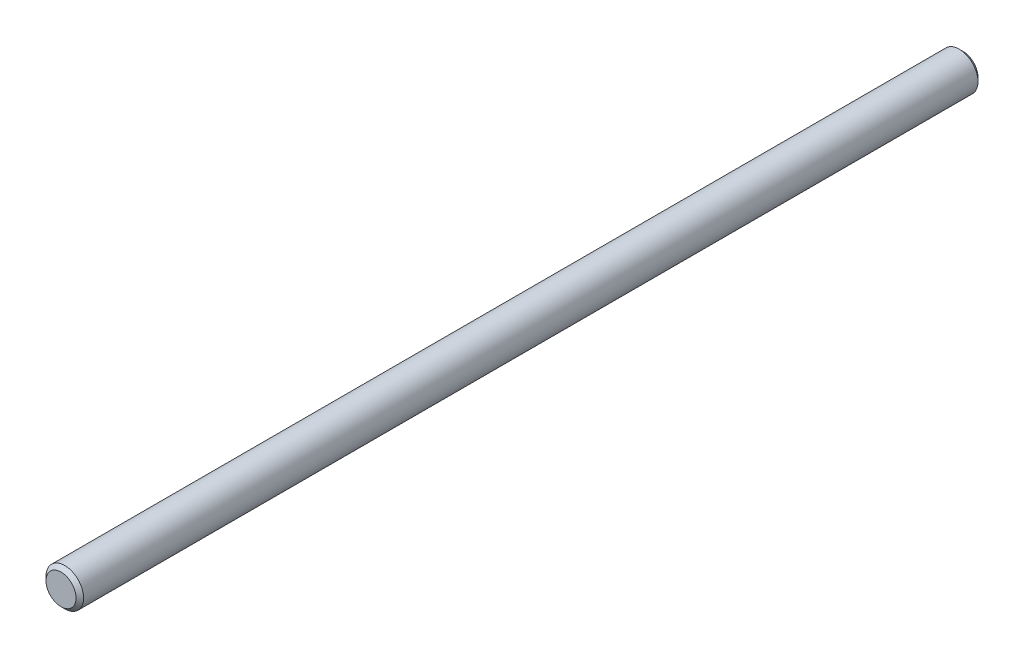
ISO-10303-21;
HEADER;
FILE_DESCRIPTION(('STEP AP214'),'2;1');
FILE_NAME('part.step','',(''),(''),'','','');
FILE_SCHEMA(('AUTOMOTIVE_DESIGN { 1 0 10303 214 1 1 1 1 }'));
ENDSEC;
DATA;
#1=APPLICATION_CONTEXT('core data for automotive mechanical design processes');
#2=APPLICATION_PROTOCOL_DEFINITION('international standard','automotive_design',2000,#1);
#3=PRODUCT_CONTEXT('',#1,'mechanical');
#4=PRODUCT('Part','Part','',(#3));
#5=PRODUCT_RELATED_PRODUCT_CATEGORY('part','',(#4));
#6=PRODUCT_DEFINITION_FORMATION('','',#4);
#7=PRODUCT_DEFINITION_CONTEXT('part definition',#1,'design');
#8=PRODUCT_DEFINITION('design','',#6,#7);
#9=PRODUCT_DEFINITION_SHAPE('','',#8);
#10=(LENGTH_UNIT() NAMED_UNIT(*) SI_UNIT(.MILLI.,.METRE.));
#11=(NAMED_UNIT(*) PLANE_ANGLE_UNIT() SI_UNIT($,.RADIAN.));
#12=(NAMED_UNIT(*) SI_UNIT($,.STERADIAN.) SOLID_ANGLE_UNIT());
#13=UNCERTAINTY_MEASURE_WITH_UNIT(LENGTH_MEASURE(1.E-05),#10,'distance_accuracy_value','');
#14=(GEOMETRIC_REPRESENTATION_CONTEXT(3) GLOBAL_UNCERTAINTY_ASSIGNED_CONTEXT((#13)) GLOBAL_UNIT_ASSIGNED_CONTEXT((#10,
#11,#12)) REPRESENTATION_CONTEXT('',''));
#15=CARTESIAN_POINT('',(0.,0.,0.));
#16=DIRECTION('',(0.,0.,1.));
#17=DIRECTION('',(1.,0.,0.));
#18=AXIS2_PLACEMENT_3D('',#15,#16,#17);
#19=CARTESIAN_POINT('',(0.,0.,152.4));
#20=DIRECTION('',(0.,0.,-1.));
#21=DIRECTION('',(-1.,0.,0.));
#22=AXIS2_PLACEMENT_3D('',#19,#20,#21);
#23=CYLINDRICAL_SURFACE('',#22,6.35);
#24=CARTESIAN_POINT('',(0.,0.,-151.13));
#25=DIRECTION('',(0.,0.,1.));
#26=DIRECTION('',(1.,0.,0.));
#27=AXIS2_PLACEMENT_3D('',#24,#25,#26);
#28=CIRCLE('',#27,6.35);
#29=CARTESIAN_POINT('',(-6.35,0.,-151.13));
#30=VERTEX_POINT('',#29);
#31=EDGE_CURVE('E41',#30,#30,#28,.T.);
#32=CARTESIAN_POINT('',(0.,0.,151.13));
#33=DIRECTION('',(0.,0.,1.));
#34=DIRECTION('',(1.,0.,0.));
#35=AXIS2_PLACEMENT_3D('',#32,#33,#34);
#36=CIRCLE('',#35,6.35);
#37=CARTESIAN_POINT('',(-6.35,0.,151.13));
#38=VERTEX_POINT('',#37);
#39=EDGE_CURVE('E45',#38,#38,#36,.F.);
#40=CARTESIAN_POINT('',(-6.35,0.,-151.13));
#41=CARTESIAN_POINT('',(-6.35,0.,-147.981458333333));
#42=CARTESIAN_POINT('',(-6.35,0.,-144.832916666666));
#43=CARTESIAN_POINT('',(-6.35,0.,-138.535833333333));
#44=CARTESIAN_POINT('',(-6.35,0.,-135.387291666666));
#45=CARTESIAN_POINT('',(-6.35,0.,-129.090208333333));
#46=CARTESIAN_POINT('',(-6.35,0.,-125.941666666666));
#47=CARTESIAN_POINT('',(-6.35,0.,-119.644583333333));
#48=CARTESIAN_POINT('',(-6.35,0.,-116.496041666666));
#49=CARTESIAN_POINT('',(-6.35,0.,-110.198958333333));
#50=CARTESIAN_POINT('',(-6.35,0.,-107.050416666666));
#51=CARTESIAN_POINT('',(-6.35,0.,-100.753333333333));
#52=CARTESIAN_POINT('',(-6.35,0.,-97.6047916666665));
#53=CARTESIAN_POINT('',(-6.35,0.,-91.3077083333331));
#54=CARTESIAN_POINT('',(-6.35,0.,-88.1591666666665));
#55=CARTESIAN_POINT('',(-6.35,0.,-81.8620833333332));
#56=CARTESIAN_POINT('',(-6.35,0.,-78.7135416666665));
#57=CARTESIAN_POINT('',(-6.35,0.,-72.4164583333332));
#58=CARTESIAN_POINT('',(-6.35,0.,-69.2679166666665));
#59=CARTESIAN_POINT('',(-6.35,0.,-62.9708333333331));
#60=CARTESIAN_POINT('',(-6.35,0.,-59.8222916666665));
#61=CARTESIAN_POINT('',(-6.35,0.,-53.5252083333331));
#62=CARTESIAN_POINT('',(-6.35,0.,-50.3766666666665));
#63=CARTESIAN_POINT('',(-6.35,0.,-44.0795833333331));
#64=CARTESIAN_POINT('',(-6.35,0.,-40.9310416666665));
#65=CARTESIAN_POINT('',(-6.35,0.,-34.6339583333331));
#66=CARTESIAN_POINT('',(-6.35,0.,-31.4854166666665));
#67=CARTESIAN_POINT('',(-6.35,0.,-25.1883333333331));
#68=CARTESIAN_POINT('',(-6.35,0.,-22.0397916666665));
#69=CARTESIAN_POINT('',(-6.35,0.,-15.7427083333331));
#70=CARTESIAN_POINT('',(-6.35,0.,-12.5941666666665));
#71=CARTESIAN_POINT('',(-6.35,0.,-6.29708333333315));
#72=CARTESIAN_POINT('',(-6.35,0.,-3.14854166666648));
#73=CARTESIAN_POINT('',(-6.35,0.,3.14854166666687));
#74=CARTESIAN_POINT('',(-6.35,0.,6.29708333333354));
#75=CARTESIAN_POINT('',(-6.35,0.,12.5941666666669));
#76=CARTESIAN_POINT('',(-6.35,0.,15.7427083333335));
#77=CARTESIAN_POINT('',(-6.35,0.,22.0397916666669));
#78=CARTESIAN_POINT('',(-6.35,0.,25.1883333333335));
#79=CARTESIAN_POINT('',(-6.35,0.,31.4854166666669));
#80=CARTESIAN_POINT('',(-6.35,0.,34.6339583333335));
#81=CARTESIAN_POINT('',(-6.35,0.,40.9310416666669));
#82=CARTESIAN_POINT('',(-6.35,0.,44.0795833333335));
#83=CARTESIAN_POINT('',(-6.35,0.,50.3766666666669));
#84=CARTESIAN_POINT('',(-6.35,0.,53.5252083333335));
#85=CARTESIAN_POINT('',(-6.35,0.,59.8222916666668));
#86=CARTESIAN_POINT('',(-6.35,0.,62.9708333333335));
#87=CARTESIAN_POINT('',(-6.35,0.,69.2679166666669));
#88=CARTESIAN_POINT('',(-6.35,0.,72.4164583333335));
#89=CARTESIAN_POINT('',(-6.35,0.,78.7135416666669));
#90=CARTESIAN_POINT('',(-6.35,0.,81.8620833333335));
#91=CARTESIAN_POINT('',(-6.35,0.,88.1591666666669));
#92=CARTESIAN_POINT('',(-6.35,0.,91.3077083333335));
#93=CARTESIAN_POINT('',(-6.35,0.,97.6047916666668));
#94=CARTESIAN_POINT('',(-6.35,0.,100.753333333334));
#95=CARTESIAN_POINT('',(-6.35,0.,107.050416666667));
#96=CARTESIAN_POINT('',(-6.35,0.,110.198958333334));
#97=CARTESIAN_POINT('',(-6.35,0.,116.496041666667));
#98=CARTESIAN_POINT('',(-6.35,0.,119.644583333334));
#99=CARTESIAN_POINT('',(-6.35,0.,125.941666666667));
#100=CARTESIAN_POINT('',(-6.35,0.,129.090208333334));
#101=CARTESIAN_POINT('',(-6.35,0.,135.387291666667));
#102=CARTESIAN_POINT('',(-6.35,0.,138.535833333333));
#103=CARTESIAN_POINT('',(-6.35,0.,144.832916666667));
#104=CARTESIAN_POINT('',(-6.35,0.,147.981458333334));
#105=CARTESIAN_POINT('',(-6.35,0.,151.13));
#106=B_SPLINE_CURVE_WITH_KNOTS('',3,(#40,#41,#42,#43,#44,#45,#46,#47,#48,#49,#50,#51,#52,#53,
#54,#55,#56,#57,#58,#59,#60,#61,#62,#63,#64,#65,#66,#67,#68,#69,#70,#71,#72,#73,#74,#75,#76,#77,
#78,#79,#80,#81,#82,#83,#84,#85,#86,#87,#88,#89,#90,#91,#92,#93,#94,#95,#96,#97,#98,#99,#100,
#101,#102,#103,#104,#105),.UNSPECIFIED.,.F.,.F.,(4,2,2,2,2,2,2,2,2,2,2,2,2,2,2,2,2,2,2,2,2,2,2,
2,2,2,2,2,2,2,2,2,4),(0.,9.44562500000001,18.89125,28.336875,37.7825,47.228125,56.67375,
66.119375,75.565,85.010625,94.45625,103.901875,113.3475,122.793125,132.23875,141.684375,151.13,
160.575625,170.02125,179.466875,188.9125,198.358125,207.80375,217.249375,226.695,236.140625,
245.58625,255.031875,264.4775,273.923125,283.36875,292.814375,302.26),.UNSPECIFIED.);
#107=EDGE_CURVE('BSEAM30',#30,#38,#106,.T.);
#108=ORIENTED_EDGE('',*,*,#31,.T.);
#109=ORIENTED_EDGE('',*,*,#39,.T.);
#110=ORIENTED_EDGE('',*,*,#107,.T.);
#111=ORIENTED_EDGE('',*,*,#107,.F.);
#112=EDGE_LOOP('',(#108,#110,#109,#111));
#113=FACE_BOUND('',#112,.T.);
#114=ADVANCED_FACE('F30',(#113),#23,.T.);
#115=CARTESIAN_POINT('',(0.,0.,152.4));
#116=DIRECTION('',(0.,0.,1.));
#117=DIRECTION('',(1.,0.,0.));
#118=AXIS2_PLACEMENT_3D('',#115,#116,#117);
#119=PLANE('',#118);
#120=CARTESIAN_POINT('',(0.,0.,152.4));
#121=DIRECTION('',(0.,0.,1.));
#122=DIRECTION('',(1.,0.,0.));
#123=AXIS2_PLACEMENT_3D('',#120,#121,#122);
#124=CIRCLE('',#123,5.08000000000017);
#125=CARTESIAN_POINT('',(5.08000000000017,0.,152.4));
#126=VERTEX_POINT('',#125);
#127=EDGE_CURVE('E10',#126,#126,#124,.T.);
#128=ORIENTED_EDGE('',*,*,#127,.T.);
#129=EDGE_LOOP('',(#128));
#130=FACE_BOUND('',#129,.T.);
#131=ADVANCED_FACE('F61',(#130),#119,.T.);
#132=CARTESIAN_POINT('',(0.,0.,-152.4));
#133=DIRECTION('',(0.,0.,1.));
#134=DIRECTION('',(1.,0.,0.));
#135=AXIS2_PLACEMENT_3D('',#132,#133,#134);
#136=PLANE('',#135);
#137=CARTESIAN_POINT('',(0.,0.,-152.4));
#138=DIRECTION('',(0.,0.,1.));
#139=DIRECTION('',(1.,0.,0.));
#140=AXIS2_PLACEMENT_3D('',#137,#138,#139);
#141=CIRCLE('',#140,5.07999999999975);
#142=CARTESIAN_POINT('',(5.07999999999975,0.,-152.4));
#143=VERTEX_POINT('',#142);
#144=EDGE_CURVE('E37',#143,#143,#141,.F.);
#145=ORIENTED_EDGE('',*,*,#144,.T.);
#146=EDGE_LOOP('',(#145));
#147=FACE_BOUND('',#146,.T.);
#148=ADVANCED_FACE('F58',(#147),#136,.F.);
#149=CARTESIAN_POINT('',(0.,0.,-151.13));
#150=DIRECTION('',(0.,0.,1.));
#151=DIRECTION('',(1.,0.,0.));
#152=AXIS2_PLACEMENT_3D('',#149,#150,#151);
#153=CONICAL_SURFACE('',#152,6.35,0.78539816339744);
#154=ORIENTED_EDGE('',*,*,#144,.F.);
#155=EDGE_LOOP('',(#154));
#156=FACE_BOUND('',#155,.T.);
#157=ORIENTED_EDGE('',*,*,#31,.F.);
#158=EDGE_LOOP('',(#157));
#159=FACE_BOUND('',#158,.T.);
#160=ADVANCED_FACE('F54',(#156,#159),#153,.T.);
#161=CARTESIAN_POINT('',(0.,0.,152.4));
#162=DIRECTION('',(0.,0.,-1.));
#163=DIRECTION('',(-1.,0.,0.));
#164=AXIS2_PLACEMENT_3D('',#161,#162,#163);
#165=CONICAL_SURFACE('',#164,5.08000000000017,0.785398163397451);
#166=ORIENTED_EDGE('',*,*,#39,.F.);
#167=EDGE_LOOP('',(#166));
#168=FACE_BOUND('',#167,.T.);
#169=ORIENTED_EDGE('',*,*,#127,.F.);
#170=EDGE_LOOP('',(#169));
#171=FACE_BOUND('',#170,.T.);
#172=ADVANCED_FACE('F32',(#168,#171),#165,.T.);
#173=CLOSED_SHELL('',(#114,#131,#148,#160,#172));
#174=MANIFOLD_SOLID_BREP('B2',#173);
#175=ADVANCED_BREP_SHAPE_REPRESENTATION('',(#18,#174),#14);
#176=SHAPE_DEFINITION_REPRESENTATION(#9,#175);
ENDSEC;
END-ISO-10303-21;
